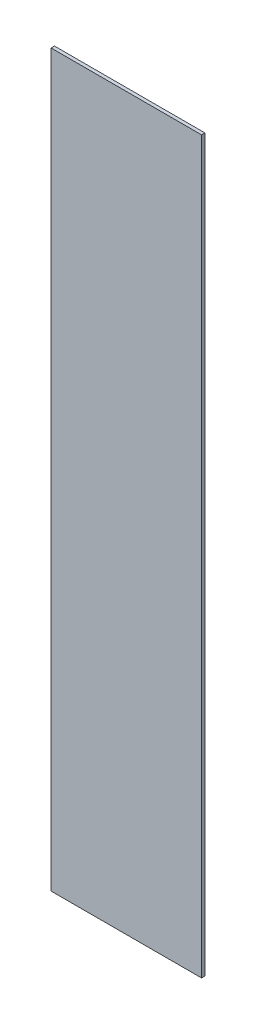
ISO-10303-21;
HEADER;
FILE_DESCRIPTION(('STEP AP214'),'2;1');
FILE_NAME('part.step','',(''),(''),'','','');
FILE_SCHEMA(('AUTOMOTIVE_DESIGN { 1 0 10303 214 1 1 1 1 }'));
ENDSEC;
DATA;
#1=APPLICATION_CONTEXT('core data for automotive mechanical design processes');
#2=APPLICATION_PROTOCOL_DEFINITION('international standard','automotive_design',2000,#1);
#3=PRODUCT_CONTEXT('',#1,'mechanical');
#4=PRODUCT('Part','Part','',(#3));
#5=PRODUCT_RELATED_PRODUCT_CATEGORY('part','',(#4));
#6=PRODUCT_DEFINITION_FORMATION('','',#4);
#7=PRODUCT_DEFINITION_CONTEXT('part definition',#1,'design');
#8=PRODUCT_DEFINITION('design','',#6,#7);
#9=PRODUCT_DEFINITION_SHAPE('','',#8);
#10=(LENGTH_UNIT() NAMED_UNIT(*) SI_UNIT(.MILLI.,.METRE.));
#11=(NAMED_UNIT(*) PLANE_ANGLE_UNIT() SI_UNIT($,.RADIAN.));
#12=(NAMED_UNIT(*) SI_UNIT($,.STERADIAN.) SOLID_ANGLE_UNIT());
#13=UNCERTAINTY_MEASURE_WITH_UNIT(LENGTH_MEASURE(1.E-05),#10,'distance_accuracy_value','');
#14=(GEOMETRIC_REPRESENTATION_CONTEXT(3) GLOBAL_UNCERTAINTY_ASSIGNED_CONTEXT((#13)) GLOBAL_UNIT_ASSIGNED_CONTEXT((#10,
#11,#12)) REPRESENTATION_CONTEXT('',''));
#15=CARTESIAN_POINT('',(0.,0.,0.));
#16=DIRECTION('',(0.,0.,1.));
#17=DIRECTION('',(1.,0.,0.));
#18=AXIS2_PLACEMENT_3D('',#15,#16,#17);
#19=CARTESIAN_POINT('',(33.5,-162.5,1.5));
#20=DIRECTION('',(-1.,0.,0.));
#21=DIRECTION('',(0.,0.,1.));
#22=AXIS2_PLACEMENT_3D('',#19,#20,#21);
#23=PLANE('',#22);
#24=DIRECTION('',(0.,1.,0.));
#25=VECTOR('',#24,1.);
#26=CARTESIAN_POINT('',(33.5,-162.5,0.));
#27=LINE('',#26,#25);
#28=CARTESIAN_POINT('',(33.5,-162.5,0.));
#29=VERTEX_POINT('',#28);
#30=CARTESIAN_POINT('',(33.5,162.5,0.));
#31=VERTEX_POINT('',#30);
#32=EDGE_CURVE('E97',#29,#31,#27,.T.);
#33=ORIENTED_EDGE('',*,*,#32,.T.);
#34=DIRECTION('',(0.,0.,-1.));
#35=VECTOR('',#34,1.);
#36=CARTESIAN_POINT('',(33.5,162.5,1.5));
#37=LINE('',#36,#35);
#38=CARTESIAN_POINT('',(33.5,162.5,1.5));
#39=VERTEX_POINT('',#38);
#40=EDGE_CURVE('E11',#39,#31,#37,.T.);
#41=ORIENTED_EDGE('',*,*,#40,.F.);
#42=DIRECTION('',(0.,1.,0.));
#43=VECTOR('',#42,1.);
#44=CARTESIAN_POINT('',(33.5,-162.5,1.5));
#45=LINE('',#44,#43);
#46=CARTESIAN_POINT('',(33.5,-162.5,1.5));
#47=VERTEX_POINT('',#46);
#48=EDGE_CURVE('E85',#47,#39,#45,.T.);
#49=ORIENTED_EDGE('',*,*,#48,.F.);
#50=DIRECTION('',(0.,0.,-1.));
#51=VECTOR('',#50,1.);
#52=CARTESIAN_POINT('',(33.5,-162.5,1.5));
#53=LINE('',#52,#51);
#54=EDGE_CURVE('E93',#47,#29,#53,.T.);
#55=ORIENTED_EDGE('',*,*,#54,.T.);
#56=EDGE_LOOP('',(#33,#41,#49,#55));
#57=FACE_BOUND('',#56,.T.);
#58=ADVANCED_FACE('F34',(#57),#23,.F.);
#59=CARTESIAN_POINT('',(-33.5,162.5,1.5));
#60=DIRECTION('',(0.,-1.,0.));
#61=DIRECTION('',(0.,0.,-1.));
#62=AXIS2_PLACEMENT_3D('',#59,#60,#61);
#63=PLANE('',#62);
#64=DIRECTION('',(-1.,0.,0.));
#65=VECTOR('',#64,1.);
#66=CARTESIAN_POINT('',(-33.5,162.5,0.));
#67=LINE('',#66,#65);
#68=CARTESIAN_POINT('',(-33.5,162.5,0.));
#69=VERTEX_POINT('',#68);
#70=EDGE_CURVE('E89',#31,#69,#67,.T.);
#71=ORIENTED_EDGE('',*,*,#70,.T.);
#72=DIRECTION('',(0.,0.,-1.));
#73=VECTOR('',#72,1.);
#74=CARTESIAN_POINT('',(-33.5,162.5,1.5));
#75=LINE('',#74,#73);
#76=CARTESIAN_POINT('',(-33.5,162.5,1.5));
#77=VERTEX_POINT('',#76);
#78=EDGE_CURVE('E42',#77,#69,#75,.T.);
#79=ORIENTED_EDGE('',*,*,#78,.F.);
#80=DIRECTION('',(-1.,0.,0.));
#81=VECTOR('',#80,1.);
#82=CARTESIAN_POINT('',(-33.5,162.5,1.5));
#83=LINE('',#82,#81);
#84=EDGE_CURVE('E80',#39,#77,#83,.T.);
#85=ORIENTED_EDGE('',*,*,#84,.F.);
#86=ORIENTED_EDGE('',*,*,#40,.T.);
#87=EDGE_LOOP('',(#71,#79,#85,#86));
#88=FACE_BOUND('',#87,.T.);
#89=ADVANCED_FACE('F88',(#88),#63,.F.);
#90=CARTESIAN_POINT('',(-33.5,-162.5,1.5));
#91=DIRECTION('',(1.,0.,0.));
#92=DIRECTION('',(0.,0.,-1.));
#93=AXIS2_PLACEMENT_3D('',#90,#91,#92);
#94=PLANE('',#93);
#95=DIRECTION('',(0.,-1.,0.));
#96=VECTOR('',#95,1.);
#97=CARTESIAN_POINT('',(-33.5,-162.5,0.));
#98=LINE('',#97,#96);
#99=CARTESIAN_POINT('',(-33.5,-162.5,0.));
#100=VERTEX_POINT('',#99);
#101=EDGE_CURVE('E67',#69,#100,#98,.T.);
#102=ORIENTED_EDGE('',*,*,#101,.T.);
#103=DIRECTION('',(0.,0.,-1.));
#104=VECTOR('',#103,1.);
#105=CARTESIAN_POINT('',(-33.5,-162.5,1.5));
#106=LINE('',#105,#104);
#107=CARTESIAN_POINT('',(-33.5,-162.5,1.5));
#108=VERTEX_POINT('',#107);
#109=EDGE_CURVE('E90',#108,#100,#106,.T.);
#110=ORIENTED_EDGE('',*,*,#109,.F.);
#111=DIRECTION('',(0.,-1.,0.));
#112=VECTOR('',#111,1.);
#113=CARTESIAN_POINT('',(-33.5,-162.5,1.5));
#114=LINE('',#113,#112);
#115=EDGE_CURVE('E83',#77,#108,#114,.T.);
#116=ORIENTED_EDGE('',*,*,#115,.F.);
#117=ORIENTED_EDGE('',*,*,#78,.T.);
#118=EDGE_LOOP('',(#102,#110,#116,#117));
#119=FACE_BOUND('',#118,.T.);
#120=ADVANCED_FACE('F91',(#119),#94,.F.);
#121=CARTESIAN_POINT('',(-33.5,-162.5,1.5));
#122=DIRECTION('',(0.,1.,0.));
#123=DIRECTION('',(0.,0.,1.));
#124=AXIS2_PLACEMENT_3D('',#121,#122,#123);
#125=PLANE('',#124);
#126=DIRECTION('',(1.,0.,0.));
#127=VECTOR('',#126,1.);
#128=CARTESIAN_POINT('',(-33.5,-162.5,0.));
#129=LINE('',#128,#127);
#130=EDGE_CURVE('E73',#100,#29,#129,.T.);
#131=ORIENTED_EDGE('',*,*,#130,.T.);
#132=ORIENTED_EDGE('',*,*,#54,.F.);
#133=DIRECTION('',(1.,0.,0.));
#134=VECTOR('',#133,1.);
#135=CARTESIAN_POINT('',(-33.5,-162.5,1.5));
#136=LINE('',#135,#134);
#137=EDGE_CURVE('E50',#108,#47,#136,.T.);
#138=ORIENTED_EDGE('',*,*,#137,.F.);
#139=ORIENTED_EDGE('',*,*,#109,.T.);
#140=EDGE_LOOP('',(#131,#132,#138,#139));
#141=FACE_BOUND('',#140,.T.);
#142=ADVANCED_FACE('F104',(#141),#125,.F.);
#143=CARTESIAN_POINT('',(0.,0.,1.5));
#144=DIRECTION('',(0.,0.,-1.));
#145=DIRECTION('',(-1.,0.,0.));
#146=AXIS2_PLACEMENT_3D('',#143,#144,#145);
#147=PLANE('',#146);
#148=ORIENTED_EDGE('',*,*,#48,.T.);
#149=ORIENTED_EDGE('',*,*,#84,.T.);
#150=ORIENTED_EDGE('',*,*,#115,.T.);
#151=ORIENTED_EDGE('',*,*,#137,.T.);
#152=EDGE_LOOP('',(#148,#149,#150,#151));
#153=FACE_BOUND('',#152,.T.);
#154=ADVANCED_FACE('F81',(#153),#147,.F.);
#155=CARTESIAN_POINT('',(0.,0.,0.));
#156=DIRECTION('',(0.,0.,-1.));
#157=DIRECTION('',(-1.,0.,0.));
#158=AXIS2_PLACEMENT_3D('',#155,#156,#157);
#159=PLANE('',#158);
#160=ORIENTED_EDGE('',*,*,#32,.F.);
#161=ORIENTED_EDGE('',*,*,#130,.F.);
#162=ORIENTED_EDGE('',*,*,#101,.F.);
#163=ORIENTED_EDGE('',*,*,#70,.F.);
#164=EDGE_LOOP('',(#160,#161,#162,#163));
#165=FACE_BOUND('',#164,.T.);
#166=ADVANCED_FACE('F107',(#165),#159,.T.);
#167=CLOSED_SHELL('',(#58,#89,#120,#142,#154,#166));
#168=MANIFOLD_SOLID_BREP('B2',#167);
#169=ADVANCED_BREP_SHAPE_REPRESENTATION('',(#18,#168),#14);
#170=SHAPE_DEFINITION_REPRESENTATION(#9,#169);
ENDSEC;
END-ISO-10303-21;
